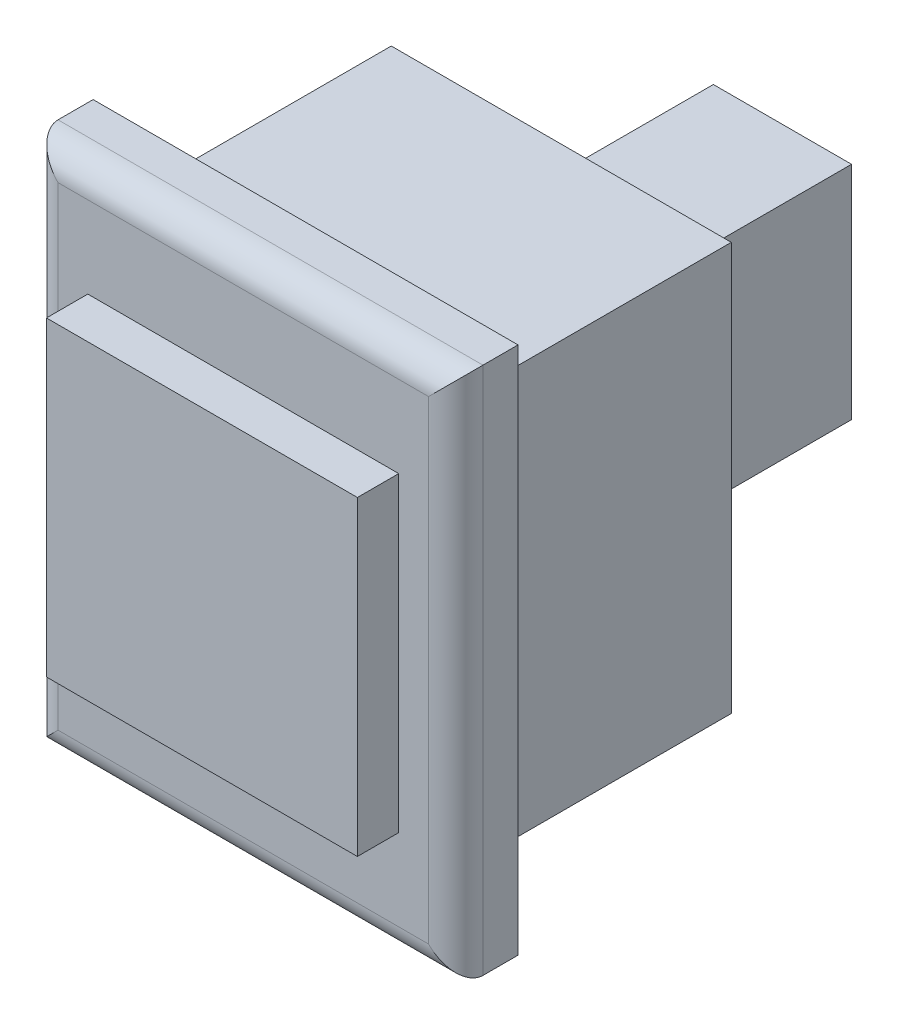
ISO-10303-21;
HEADER;
FILE_DESCRIPTION(('STEP AP214'),'2;1');
FILE_NAME('part.step','',(''),(''),'','','');
FILE_SCHEMA(('AUTOMOTIVE_DESIGN { 1 0 10303 214 1 1 1 1 }'));
ENDSEC;
DATA;
#1=APPLICATION_CONTEXT('core data for automotive mechanical design processes');
#2=APPLICATION_PROTOCOL_DEFINITION('international standard','automotive_design',2000,#1);
#3=PRODUCT_CONTEXT('',#1,'mechanical');
#4=PRODUCT('Part','Part','',(#3));
#5=PRODUCT_RELATED_PRODUCT_CATEGORY('part','',(#4));
#6=PRODUCT_DEFINITION_FORMATION('','',#4);
#7=PRODUCT_DEFINITION_CONTEXT('part definition',#1,'design');
#8=PRODUCT_DEFINITION('design','',#6,#7);
#9=PRODUCT_DEFINITION_SHAPE('','',#8);
#10=(LENGTH_UNIT() NAMED_UNIT(*) SI_UNIT(.MILLI.,.METRE.));
#11=(NAMED_UNIT(*) PLANE_ANGLE_UNIT() SI_UNIT($,.RADIAN.));
#12=(NAMED_UNIT(*) SI_UNIT($,.STERADIAN.) SOLID_ANGLE_UNIT());
#13=UNCERTAINTY_MEASURE_WITH_UNIT(LENGTH_MEASURE(1.E-05),#10,'distance_accuracy_value','');
#14=(GEOMETRIC_REPRESENTATION_CONTEXT(3) GLOBAL_UNCERTAINTY_ASSIGNED_CONTEXT((#13)) GLOBAL_UNIT_ASSIGNED_CONTEXT((#10,
#11,#12)) REPRESENTATION_CONTEXT('',''));
#15=CARTESIAN_POINT('',(0.,0.,0.));
#16=DIRECTION('',(0.,0.,1.));
#17=DIRECTION('',(1.,0.,0.));
#18=AXIS2_PLACEMENT_3D('',#15,#16,#17);
#19=CARTESIAN_POINT('',(0.,0.,-9.4));
#20=DIRECTION('',(0.,0.,-1.));
#21=DIRECTION('',(-1.,0.,0.));
#22=AXIS2_PLACEMENT_3D('',#19,#20,#21);
#23=PLANE('',#22);
#24=DIRECTION('',(0.,1.,0.));
#25=VECTOR('',#24,1.);
#26=CARTESIAN_POINT('',(-6.25,7.5,-9.4));
#27=LINE('',#26,#25);
#28=CARTESIAN_POINT('',(-6.25,-7.5,-9.4));
#29=VERTEX_POINT('',#28);
#30=CARTESIAN_POINT('',(-6.25,7.5,-9.4));
#31=VERTEX_POINT('',#30);
#32=EDGE_CURVE('E191',#29,#31,#27,.T.);
#33=ORIENTED_EDGE('',*,*,#32,.T.);
#34=DIRECTION('',(1.,0.,0.));
#35=VECTOR('',#34,1.);
#36=CARTESIAN_POINT('',(6.25,7.5,-9.4));
#37=LINE('',#36,#35);
#38=CARTESIAN_POINT('',(6.25,7.5,-9.4));
#39=VERTEX_POINT('',#38);
#40=EDGE_CURVE('E194',#31,#39,#37,.T.);
#41=ORIENTED_EDGE('',*,*,#40,.T.);
#42=DIRECTION('',(0.,-1.,0.));
#43=VECTOR('',#42,1.);
#44=CARTESIAN_POINT('',(6.25,7.5,-9.4));
#45=LINE('',#44,#43);
#46=CARTESIAN_POINT('',(6.25,-7.5,-9.4));
#47=VERTEX_POINT('',#46);
#48=EDGE_CURVE('E197',#39,#47,#45,.T.);
#49=ORIENTED_EDGE('',*,*,#48,.T.);
#50=DIRECTION('',(-1.,0.,0.));
#51=VECTOR('',#50,1.);
#52=CARTESIAN_POINT('',(6.25,-7.5,-9.4));
#53=LINE('',#52,#51);
#54=EDGE_CURVE('E199',#47,#29,#53,.T.);
#55=ORIENTED_EDGE('',*,*,#54,.T.);
#56=EDGE_LOOP('',(#33,#41,#49,#55));
#57=FACE_BOUND('',#56,.T.);
#58=DIRECTION('',(1.,0.,0.));
#59=VECTOR('',#58,1.);
#60=CARTESIAN_POINT('',(2.54,4.065,-9.4));
#61=LINE('',#60,#59);
#62=CARTESIAN_POINT('',(-2.54,4.065,-9.4));
#63=VERTEX_POINT('',#62);
#64=CARTESIAN_POINT('',(2.54,4.065,-9.4));
#65=VERTEX_POINT('',#64);
#66=EDGE_CURVE('E564',#63,#65,#61,.T.);
#67=ORIENTED_EDGE('',*,*,#66,.F.);
#68=DIRECTION('',(0.,1.,0.));
#69=VECTOR('',#68,1.);
#70=CARTESIAN_POINT('',(-2.54,4.065,-9.4));
#71=LINE('',#70,#69);
#72=CARTESIAN_POINT('',(-2.54,-4.065,-9.4));
#73=VERTEX_POINT('',#72);
#74=EDGE_CURVE('E182',#73,#63,#71,.T.);
#75=ORIENTED_EDGE('',*,*,#74,.F.);
#76=DIRECTION('',(-1.,0.,0.));
#77=VECTOR('',#76,1.);
#78=CARTESIAN_POINT('',(2.54,-4.065,-9.4));
#79=LINE('',#78,#77);
#80=CARTESIAN_POINT('',(2.54,-4.065,-9.4));
#81=VERTEX_POINT('',#80);
#82=EDGE_CURVE('E178',#81,#73,#79,.T.);
#83=ORIENTED_EDGE('',*,*,#82,.F.);
#84=DIRECTION('',(0.,-1.,0.));
#85=VECTOR('',#84,1.);
#86=CARTESIAN_POINT('',(2.54,4.065,-9.4));
#87=LINE('',#86,#85);
#88=EDGE_CURVE('E561',#65,#81,#87,.T.);
#89=ORIENTED_EDGE('',*,*,#88,.F.);
#90=EDGE_LOOP('',(#67,#75,#83,#89));
#91=FACE_BOUND('',#90,.T.);
#92=ADVANCED_FACE('F33',(#57,#91),#23,.T.);
#93=CARTESIAN_POINT('',(0.,0.,0.));
#94=DIRECTION('',(0.,0.,1.));
#95=DIRECTION('',(1.,0.,0.));
#96=AXIS2_PLACEMENT_3D('',#93,#94,#95);
#97=PLANE('',#96);
#98=DIRECTION('',(0.,1.,0.));
#99=VECTOR('',#98,1.);
#100=CARTESIAN_POINT('',(7.81,9.715,0.));
#101=LINE('',#100,#99);
#102=CARTESIAN_POINT('',(7.81,-9.715,0.));
#103=VERTEX_POINT('',#102);
#104=CARTESIAN_POINT('',(7.81,9.715,0.));
#105=VERTEX_POINT('',#104);
#106=EDGE_CURVE('E255',#103,#105,#101,.T.);
#107=ORIENTED_EDGE('',*,*,#106,.F.);
#108=DIRECTION('',(1.,0.,0.));
#109=VECTOR('',#108,1.);
#110=CARTESIAN_POINT('',(-7.81,-9.715,0.));
#111=LINE('',#110,#109);
#112=CARTESIAN_POINT('',(-7.81,-9.715,0.));
#113=VERTEX_POINT('',#112);
#114=EDGE_CURVE('E264',#113,#103,#111,.T.);
#115=ORIENTED_EDGE('',*,*,#114,.F.);
#116=DIRECTION('',(0.,-1.,0.));
#117=VECTOR('',#116,1.);
#118=CARTESIAN_POINT('',(-7.81,9.715,0.));
#119=LINE('',#118,#117);
#120=CARTESIAN_POINT('',(-7.81,9.715,0.));
#121=VERTEX_POINT('',#120);
#122=EDGE_CURVE('E261',#121,#113,#119,.T.);
#123=ORIENTED_EDGE('',*,*,#122,.F.);
#124=DIRECTION('',(-1.,0.,0.));
#125=VECTOR('',#124,1.);
#126=CARTESIAN_POINT('',(-7.81,9.715,0.));
#127=LINE('',#126,#125);
#128=EDGE_CURVE('E258',#105,#121,#127,.T.);
#129=ORIENTED_EDGE('',*,*,#128,.F.);
#130=EDGE_LOOP('',(#107,#115,#123,#129));
#131=FACE_BOUND('',#130,.T.);
#132=DIRECTION('',(0.,1.,0.));
#133=VECTOR('',#132,1.);
#134=CARTESIAN_POINT('',(-6.25,7.5,0.));
#135=LINE('',#134,#133);
#136=CARTESIAN_POINT('',(-6.25,-7.5,0.));
#137=VERTEX_POINT('',#136);
#138=CARTESIAN_POINT('',(-6.25,7.5,0.));
#139=VERTEX_POINT('',#138);
#140=EDGE_CURVE('E184',#137,#139,#135,.T.);
#141=ORIENTED_EDGE('',*,*,#140,.F.);
#142=DIRECTION('',(-1.,0.,0.));
#143=VECTOR('',#142,1.);
#144=CARTESIAN_POINT('',(6.25,-7.5,0.));
#145=LINE('',#144,#143);
#146=CARTESIAN_POINT('',(6.25,-7.5,0.));
#147=VERTEX_POINT('',#146);
#148=EDGE_CURVE('E195',#147,#137,#145,.T.);
#149=ORIENTED_EDGE('',*,*,#148,.F.);
#150=DIRECTION('',(0.,-1.,0.));
#151=VECTOR('',#150,1.);
#152=CARTESIAN_POINT('',(6.25,7.5,0.));
#153=LINE('',#152,#151);
#154=CARTESIAN_POINT('',(6.25,7.5,0.));
#155=VERTEX_POINT('',#154);
#156=EDGE_CURVE('E203',#155,#147,#153,.T.);
#157=ORIENTED_EDGE('',*,*,#156,.F.);
#158=DIRECTION('',(1.,0.,0.));
#159=VECTOR('',#158,1.);
#160=CARTESIAN_POINT('',(6.25,7.5,0.));
#161=LINE('',#160,#159);
#162=EDGE_CURVE('E58',#139,#155,#161,.T.);
#163=ORIENTED_EDGE('',*,*,#162,.F.);
#164=EDGE_LOOP('',(#141,#149,#157,#163));
#165=FACE_BOUND('',#164,.T.);
#166=ADVANCED_FACE('F320',(#131,#165),#97,.F.);
#167=CARTESIAN_POINT('',(7.81,9.715,2.29));
#168=DIRECTION('',(-1.,0.,0.));
#169=DIRECTION('',(0.,-1.,0.));
#170=AXIS2_PLACEMENT_3D('',#167,#168,#169);
#171=PLANE('',#170);
#172=DIRECTION('',(0.,0.,-1.));
#173=VECTOR('',#172,1.);
#174=CARTESIAN_POINT('',(7.81,9.715,2.29));
#175=LINE('',#174,#173);
#176=CARTESIAN_POINT('',(7.81,9.715,1.29));
#177=VERTEX_POINT('',#176);
#178=EDGE_CURVE('E273',#177,#105,#175,.T.);
#179=ORIENTED_EDGE('',*,*,#178,.F.);
#180=DIRECTION('',(0.,1.,0.));
#181=VECTOR('',#180,1.);
#182=CARTESIAN_POINT('',(7.81,-9.715,1.29));
#183=LINE('',#182,#181);
#184=CARTESIAN_POINT('',(7.81,-9.715,1.29));
#185=VERTEX_POINT('',#184);
#186=EDGE_CURVE('E42',#177,#185,#183,.F.);
#187=ORIENTED_EDGE('',*,*,#186,.T.);
#188=DIRECTION('',(0.,0.,-1.));
#189=VECTOR('',#188,1.);
#190=CARTESIAN_POINT('',(7.81,-9.715,2.29));
#191=LINE('',#190,#189);
#192=EDGE_CURVE('E267',#185,#103,#191,.T.);
#193=ORIENTED_EDGE('',*,*,#192,.T.);
#194=ORIENTED_EDGE('',*,*,#106,.T.);
#195=EDGE_LOOP('',(#179,#187,#193,#194));
#196=FACE_BOUND('',#195,.T.);
#197=ADVANCED_FACE('F311',(#196),#171,.F.);
#198=CARTESIAN_POINT('',(-7.81,9.715,2.29));
#199=DIRECTION('',(0.,-1.,0.));
#200=DIRECTION('',(0.,0.,-1.));
#201=AXIS2_PLACEMENT_3D('',#198,#199,#200);
#202=PLANE('',#201);
#203=DIRECTION('',(0.,0.,-1.));
#204=VECTOR('',#203,1.);
#205=CARTESIAN_POINT('',(-7.81,9.715,2.29));
#206=LINE('',#205,#204);
#207=CARTESIAN_POINT('',(-7.81,9.715,1.29));
#208=VERTEX_POINT('',#207);
#209=EDGE_CURVE('E271',#208,#121,#206,.T.);
#210=ORIENTED_EDGE('',*,*,#209,.F.);
#211=DIRECTION('',(-1.,0.,0.));
#212=VECTOR('',#211,1.);
#213=CARTESIAN_POINT('',(7.81,9.715,1.29));
#214=LINE('',#213,#212);
#215=EDGE_CURVE('E11',#208,#177,#214,.F.);
#216=ORIENTED_EDGE('',*,*,#215,.T.);
#217=ORIENTED_EDGE('',*,*,#178,.T.);
#218=ORIENTED_EDGE('',*,*,#128,.T.);
#219=EDGE_LOOP('',(#210,#216,#217,#218));
#220=FACE_BOUND('',#219,.T.);
#221=ADVANCED_FACE('F323',(#220),#202,.F.);
#222=CARTESIAN_POINT('',(-7.81,9.715,2.29));
#223=DIRECTION('',(1.,0.,0.));
#224=DIRECTION('',(0.,1.,0.));
#225=AXIS2_PLACEMENT_3D('',#222,#223,#224);
#226=PLANE('',#225);
#227=DIRECTION('',(0.,0.,-1.));
#228=VECTOR('',#227,1.);
#229=CARTESIAN_POINT('',(-7.81,-9.715,2.29));
#230=LINE('',#229,#228);
#231=CARTESIAN_POINT('',(-7.81,-9.715,1.29));
#232=VERTEX_POINT('',#231);
#233=EDGE_CURVE('E269',#232,#113,#230,.T.);
#234=ORIENTED_EDGE('',*,*,#233,.F.);
#235=DIRECTION('',(0.,-1.,0.));
#236=VECTOR('',#235,1.);
#237=CARTESIAN_POINT('',(-7.81,9.715,1.29));
#238=LINE('',#237,#236);
#239=EDGE_CURVE('E284',#232,#208,#238,.F.);
#240=ORIENTED_EDGE('',*,*,#239,.T.);
#241=ORIENTED_EDGE('',*,*,#209,.T.);
#242=ORIENTED_EDGE('',*,*,#122,.T.);
#243=EDGE_LOOP('',(#234,#240,#241,#242));
#244=FACE_BOUND('',#243,.T.);
#245=ADVANCED_FACE('F325',(#244),#226,.F.);
#246=CARTESIAN_POINT('',(-7.81,-9.715,2.29));
#247=DIRECTION('',(0.,1.,0.));
#248=DIRECTION('',(0.,0.,1.));
#249=AXIS2_PLACEMENT_3D('',#246,#247,#248);
#250=PLANE('',#249);
#251=ORIENTED_EDGE('',*,*,#192,.F.);
#252=DIRECTION('',(1.,0.,0.));
#253=VECTOR('',#252,1.);
#254=CARTESIAN_POINT('',(-7.81,-9.715,1.29));
#255=LINE('',#254,#253);
#256=EDGE_CURVE('E287',#185,#232,#255,.F.);
#257=ORIENTED_EDGE('',*,*,#256,.T.);
#258=ORIENTED_EDGE('',*,*,#233,.T.);
#259=ORIENTED_EDGE('',*,*,#114,.T.);
#260=EDGE_LOOP('',(#251,#257,#258,#259));
#261=FACE_BOUND('',#260,.T.);
#262=ADVANCED_FACE('F313',(#261),#250,.F.);
#263=CARTESIAN_POINT('',(0.,0.,2.29));
#264=DIRECTION('',(0.,0.,1.));
#265=DIRECTION('',(1.,0.,0.));
#266=AXIS2_PLACEMENT_3D('',#263,#264,#265);
#267=PLANE('',#266);
#268=DIRECTION('',(-1.,0.,0.));
#269=VECTOR('',#268,1.);
#270=CARTESIAN_POINT('',(-7.81,8.715,2.29));
#271=LINE('',#270,#269);
#272=CARTESIAN_POINT('',(6.81,8.715,2.29));
#273=VERTEX_POINT('',#272);
#274=CARTESIAN_POINT('',(-6.81,8.715,2.29));
#275=VERTEX_POINT('',#274);
#276=EDGE_CURVE('E275',#273,#275,#271,.T.);
#277=ORIENTED_EDGE('',*,*,#276,.T.);
#278=DIRECTION('',(0.,-1.,0.));
#279=VECTOR('',#278,1.);
#280=CARTESIAN_POINT('',(-6.81,-9.715,2.29));
#281=LINE('',#280,#279);
#282=CARTESIAN_POINT('',(-6.81,-8.715,2.29));
#283=VERTEX_POINT('',#282);
#284=EDGE_CURVE('E281',#275,#283,#281,.T.);
#285=ORIENTED_EDGE('',*,*,#284,.T.);
#286=DIRECTION('',(1.,0.,0.));
#287=VECTOR('',#286,1.);
#288=CARTESIAN_POINT('',(7.81,-8.715,2.29));
#289=LINE('',#288,#287);
#290=CARTESIAN_POINT('',(6.81,-8.715,2.29));
#291=VERTEX_POINT('',#290);
#292=EDGE_CURVE('E279',#283,#291,#289,.T.);
#293=ORIENTED_EDGE('',*,*,#292,.T.);
#294=DIRECTION('',(0.,1.,0.));
#295=VECTOR('',#294,1.);
#296=CARTESIAN_POINT('',(6.81,9.715,2.29));
#297=LINE('',#296,#295);
#298=EDGE_CURVE('E277',#291,#273,#297,.T.);
#299=ORIENTED_EDGE('',*,*,#298,.T.);
#300=EDGE_LOOP('',(#277,#285,#293,#299));
#301=FACE_BOUND('',#300,.T.);
#302=DIRECTION('',(0.,1.,0.));
#303=VECTOR('',#302,1.);
#304=CARTESIAN_POINT('',(5.715,0.,2.29));
#305=LINE('',#304,#303);
#306=CARTESIAN_POINT('',(5.715,-5.715,2.29));
#307=VERTEX_POINT('',#306);
#308=CARTESIAN_POINT('',(5.715,5.715,2.29));
#309=VERTEX_POINT('',#308);
#310=EDGE_CURVE('E252',#307,#309,#305,.T.);
#311=ORIENTED_EDGE('',*,*,#310,.F.);
#312=DIRECTION('',(1.,0.,0.));
#313=VECTOR('',#312,1.);
#314=CARTESIAN_POINT('',(0.,-5.715,2.29));
#315=LINE('',#314,#313);
#316=CARTESIAN_POINT('',(-5.71500000000001,-5.715,2.29));
#317=VERTEX_POINT('',#316);
#318=EDGE_CURVE('E235',#317,#307,#315,.T.);
#319=ORIENTED_EDGE('',*,*,#318,.F.);
#320=DIRECTION('',(0.,-1.,0.));
#321=VECTOR('',#320,1.);
#322=CARTESIAN_POINT('',(-5.715,0.,2.29));
#323=LINE('',#322,#321);
#324=CARTESIAN_POINT('',(-5.715,5.715,2.29));
#325=VERTEX_POINT('',#324);
#326=EDGE_CURVE('E246',#325,#317,#323,.T.);
#327=ORIENTED_EDGE('',*,*,#326,.F.);
#328=DIRECTION('',(-1.,0.,0.));
#329=VECTOR('',#328,1.);
#330=CARTESIAN_POINT('',(0.,5.715,2.29));
#331=LINE('',#330,#329);
#332=EDGE_CURVE('E249',#309,#325,#331,.T.);
#333=ORIENTED_EDGE('',*,*,#332,.F.);
#334=EDGE_LOOP('',(#311,#319,#327,#333));
#335=FACE_BOUND('',#334,.T.);
#336=ADVANCED_FACE('F333',(#301,#335),#267,.T.);
#337=CARTESIAN_POINT('',(5.715,5.715,3.81));
#338=DIRECTION('',(1.,0.,0.));
#339=DIRECTION('',(0.,1.,0.));
#340=AXIS2_PLACEMENT_3D('',#337,#338,#339);
#341=PLANE('',#340);
#342=DIRECTION('',(0.,0.,-1.));
#343=VECTOR('',#342,1.);
#344=CARTESIAN_POINT('',(5.715,-5.715,3.81));
#345=LINE('',#344,#343);
#346=CARTESIAN_POINT('',(5.715,-5.715,3.81));
#347=VERTEX_POINT('',#346);
#348=EDGE_CURVE('E231',#347,#307,#345,.T.);
#349=ORIENTED_EDGE('',*,*,#348,.T.);
#350=ORIENTED_EDGE('',*,*,#310,.T.);
#351=DIRECTION('',(0.,0.,-1.));
#352=VECTOR('',#351,1.);
#353=CARTESIAN_POINT('',(5.715,5.715,3.81));
#354=LINE('',#353,#352);
#355=CARTESIAN_POINT('',(5.715,5.715,3.81));
#356=VERTEX_POINT('',#355);
#357=EDGE_CURVE('E232',#356,#309,#354,.T.);
#358=ORIENTED_EDGE('',*,*,#357,.F.);
#359=DIRECTION('',(0.,-1.,0.));
#360=VECTOR('',#359,1.);
#361=CARTESIAN_POINT('',(5.715,5.715,3.81));
#362=LINE('',#361,#360);
#363=EDGE_CURVE('E219',#356,#347,#362,.T.);
#364=ORIENTED_EDGE('',*,*,#363,.T.);
#365=EDGE_LOOP('',(#349,#350,#358,#364));
#366=FACE_BOUND('',#365,.T.);
#367=ADVANCED_FACE('F336',(#366),#341,.T.);
#368=CARTESIAN_POINT('',(-5.715,5.715,3.81));
#369=DIRECTION('',(0.,1.,0.));
#370=DIRECTION('',(-1.,0.,0.));
#371=AXIS2_PLACEMENT_3D('',#368,#369,#370);
#372=PLANE('',#371);
#373=ORIENTED_EDGE('',*,*,#357,.T.);
#374=ORIENTED_EDGE('',*,*,#332,.T.);
#375=DIRECTION('',(0.,0.,-1.));
#376=VECTOR('',#375,1.);
#377=CARTESIAN_POINT('',(-5.715,5.715,3.81));
#378=LINE('',#377,#376);
#379=CARTESIAN_POINT('',(-5.715,5.715,3.81));
#380=VERTEX_POINT('',#379);
#381=EDGE_CURVE('E236',#380,#325,#378,.T.);
#382=ORIENTED_EDGE('',*,*,#381,.F.);
#383=DIRECTION('',(1.,0.,0.));
#384=VECTOR('',#383,1.);
#385=CARTESIAN_POINT('',(-5.715,5.715,3.81));
#386=LINE('',#385,#384);
#387=EDGE_CURVE('E228',#380,#356,#386,.T.);
#388=ORIENTED_EDGE('',*,*,#387,.T.);
#389=EDGE_LOOP('',(#373,#374,#382,#388));
#390=FACE_BOUND('',#389,.T.);
#391=ADVANCED_FACE('F348',(#390),#372,.T.);
#392=CARTESIAN_POINT('',(-5.715,5.715,3.81));
#393=DIRECTION('',(-1.,0.,0.));
#394=DIRECTION('',(0.,-1.,0.));
#395=AXIS2_PLACEMENT_3D('',#392,#393,#394);
#396=PLANE('',#395);
#397=ORIENTED_EDGE('',*,*,#381,.T.);
#398=ORIENTED_EDGE('',*,*,#326,.T.);
#399=DIRECTION('',(0.,0.,-1.));
#400=VECTOR('',#399,1.);
#401=CARTESIAN_POINT('',(-5.71500000000001,-5.715,3.81));
#402=LINE('',#401,#400);
#403=CARTESIAN_POINT('',(-5.71500000000001,-5.715,3.81));
#404=VERTEX_POINT('',#403);
#405=EDGE_CURVE('E239',#404,#317,#402,.T.);
#406=ORIENTED_EDGE('',*,*,#405,.F.);
#407=DIRECTION('',(0.,1.,0.));
#408=VECTOR('',#407,1.);
#409=CARTESIAN_POINT('',(-5.715,5.715,3.81));
#410=LINE('',#409,#408);
#411=EDGE_CURVE('E225',#404,#380,#410,.T.);
#412=ORIENTED_EDGE('',*,*,#411,.T.);
#413=EDGE_LOOP('',(#397,#398,#406,#412));
#414=FACE_BOUND('',#413,.T.);
#415=ADVANCED_FACE('F350',(#414),#396,.T.);
#416=CARTESIAN_POINT('',(-5.71500000000001,-5.715,3.81));
#417=DIRECTION('',(0.,-1.,0.));
#418=DIRECTION('',(1.,0.,0.));
#419=AXIS2_PLACEMENT_3D('',#416,#417,#418);
#420=PLANE('',#419);
#421=ORIENTED_EDGE('',*,*,#405,.T.);
#422=ORIENTED_EDGE('',*,*,#318,.T.);
#423=ORIENTED_EDGE('',*,*,#348,.F.);
#424=DIRECTION('',(-1.,0.,0.));
#425=VECTOR('',#424,1.);
#426=CARTESIAN_POINT('',(-5.71500000000001,-5.715,3.81));
#427=LINE('',#426,#425);
#428=EDGE_CURVE('E222',#347,#404,#427,.T.);
#429=ORIENTED_EDGE('',*,*,#428,.T.);
#430=EDGE_LOOP('',(#421,#422,#423,#429));
#431=FACE_BOUND('',#430,.T.);
#432=ADVANCED_FACE('F340',(#431),#420,.T.);
#433=CARTESIAN_POINT('',(0.,0.,3.81));
#434=DIRECTION('',(0.,0.,1.));
#435=DIRECTION('',(1.,0.,0.));
#436=AXIS2_PLACEMENT_3D('',#433,#434,#435);
#437=PLANE('',#436);
#438=ORIENTED_EDGE('',*,*,#363,.F.);
#439=ORIENTED_EDGE('',*,*,#387,.F.);
#440=ORIENTED_EDGE('',*,*,#411,.F.);
#441=ORIENTED_EDGE('',*,*,#428,.F.);
#442=EDGE_LOOP('',(#438,#439,#440,#441));
#443=FACE_BOUND('',#442,.T.);
#444=ADVANCED_FACE('F345',(#443),#437,.T.);
#445=CARTESIAN_POINT('',(6.81,0.,1.29));
#446=DIRECTION('',(0.,-1.,0.));
#447=DIRECTION('',(1.,0.,0.));
#448=AXIS2_PLACEMENT_3D('',#445,#446,#447);
#449=CYLINDRICAL_SURFACE('',#448,1.);
#450=CARTESIAN_POINT('',(6.81,-8.715,1.29));
#451=DIRECTION('',(-0.707106781186547,-0.707106781186548,0.));
#452=DIRECTION('',(0.707106781186548,-0.707106781186547,0.));
#453=AXIS2_PLACEMENT_3D('',#450,#451,#452);
#454=ELLIPSE('',#453,1.4142135623731,1.);
#455=EDGE_CURVE('E292',#185,#291,#454,.T.);
#456=ORIENTED_EDGE('',*,*,#455,.F.);
#457=ORIENTED_EDGE('',*,*,#186,.F.);
#458=CARTESIAN_POINT('',(6.81,8.715,1.29));
#459=DIRECTION('',(0.707106781186548,-0.707106781186547,0.));
#460=DIRECTION('',(0.707106781186547,0.707106781186548,0.));
#461=AXIS2_PLACEMENT_3D('',#458,#459,#460);
#462=ELLIPSE('',#461,1.41421356237309,1.);
#463=EDGE_CURVE('E37',#273,#177,#462,.F.);
#464=ORIENTED_EDGE('',*,*,#463,.F.);
#465=ORIENTED_EDGE('',*,*,#298,.F.);
#466=EDGE_LOOP('',(#456,#457,#464,#465));
#467=FACE_BOUND('',#466,.T.);
#468=ADVANCED_FACE('F35',(#467),#449,.T.);
#469=CARTESIAN_POINT('',(0.,8.715,1.29));
#470=DIRECTION('',(1.,0.,0.));
#471=DIRECTION('',(0.,0.,-1.));
#472=AXIS2_PLACEMENT_3D('',#469,#470,#471);
#473=CYLINDRICAL_SURFACE('',#472,1.);
#474=ORIENTED_EDGE('',*,*,#463,.T.);
#475=ORIENTED_EDGE('',*,*,#215,.F.);
#476=CARTESIAN_POINT('',(-6.81,8.715,1.29));
#477=DIRECTION('',(0.707106781186547,0.707106781186548,0.));
#478=DIRECTION('',(0.707106781186548,-0.707106781186547,0.));
#479=AXIS2_PLACEMENT_3D('',#476,#477,#478);
#480=ELLIPSE('',#479,1.4142135623731,1.);
#481=EDGE_CURVE('E291',#275,#208,#480,.F.);
#482=ORIENTED_EDGE('',*,*,#481,.F.);
#483=ORIENTED_EDGE('',*,*,#276,.F.);
#484=EDGE_LOOP('',(#474,#475,#482,#483));
#485=FACE_BOUND('',#484,.T.);
#486=ADVANCED_FACE('F303',(#485),#473,.T.);
#487=CARTESIAN_POINT('',(0.,-8.715,1.29));
#488=DIRECTION('',(-1.,0.,0.));
#489=DIRECTION('',(0.,0.,1.));
#490=AXIS2_PLACEMENT_3D('',#487,#488,#489);
#491=CYLINDRICAL_SURFACE('',#490,1.);
#492=ORIENTED_EDGE('',*,*,#455,.T.);
#493=ORIENTED_EDGE('',*,*,#292,.F.);
#494=CARTESIAN_POINT('',(-6.81,-8.715,1.29));
#495=DIRECTION('',(-0.707106781186548,0.707106781186547,0.));
#496=DIRECTION('',(-0.707106781186547,-0.707106781186548,0.));
#497=AXIS2_PLACEMENT_3D('',#494,#495,#496);
#498=ELLIPSE('',#497,1.41421356237309,1.);
#499=EDGE_CURVE('E218',#232,#283,#498,.T.);
#500=ORIENTED_EDGE('',*,*,#499,.F.);
#501=ORIENTED_EDGE('',*,*,#256,.F.);
#502=EDGE_LOOP('',(#492,#493,#500,#501));
#503=FACE_BOUND('',#502,.T.);
#504=ADVANCED_FACE('F331',(#503),#491,.T.);
#505=CARTESIAN_POINT('',(-6.81,0.,1.29));
#506=DIRECTION('',(0.,1.,0.));
#507=DIRECTION('',(-1.,0.,0.));
#508=AXIS2_PLACEMENT_3D('',#505,#506,#507);
#509=CYLINDRICAL_SURFACE('',#508,1.);
#510=ORIENTED_EDGE('',*,*,#481,.T.);
#511=ORIENTED_EDGE('',*,*,#239,.F.);
#512=ORIENTED_EDGE('',*,*,#499,.T.);
#513=ORIENTED_EDGE('',*,*,#284,.F.);
#514=EDGE_LOOP('',(#510,#511,#512,#513));
#515=FACE_BOUND('',#514,.T.);
#516=ADVANCED_FACE('F329',(#515),#509,.T.);
#517=CARTESIAN_POINT('',(-6.25,7.5,-9.4));
#518=DIRECTION('',(1.,0.,0.));
#519=DIRECTION('',(0.,1.,0.));
#520=AXIS2_PLACEMENT_3D('',#517,#518,#519);
#521=PLANE('',#520);
#522=ORIENTED_EDGE('',*,*,#140,.T.);
#523=DIRECTION('',(0.,0.,1.));
#524=VECTOR('',#523,1.);
#525=CARTESIAN_POINT('',(-6.25,7.5,-9.4));
#526=LINE('',#525,#524);
#527=EDGE_CURVE('E216',#31,#139,#526,.T.);
#528=ORIENTED_EDGE('',*,*,#527,.F.);
#529=ORIENTED_EDGE('',*,*,#32,.F.);
#530=DIRECTION('',(0.,0.,1.));
#531=VECTOR('',#530,1.);
#532=CARTESIAN_POINT('',(-6.25,-7.5,-9.4));
#533=LINE('',#532,#531);
#534=EDGE_CURVE('E200',#29,#137,#533,.T.);
#535=ORIENTED_EDGE('',*,*,#534,.T.);
#536=EDGE_LOOP('',(#522,#528,#529,#535));
#537=FACE_BOUND('',#536,.T.);
#538=ADVANCED_FACE('F381',(#537),#521,.F.);
#539=CARTESIAN_POINT('',(6.25,7.5,-9.4));
#540=DIRECTION('',(0.,-1.,0.));
#541=DIRECTION('',(0.,0.,-1.));
#542=AXIS2_PLACEMENT_3D('',#539,#540,#541);
#543=PLANE('',#542);
#544=ORIENTED_EDGE('',*,*,#162,.T.);
#545=DIRECTION('',(0.,0.,1.));
#546=VECTOR('',#545,1.);
#547=CARTESIAN_POINT('',(6.25,7.5,-9.4));
#548=LINE('',#547,#546);
#549=EDGE_CURVE('E213',#39,#155,#548,.T.);
#550=ORIENTED_EDGE('',*,*,#549,.F.);
#551=ORIENTED_EDGE('',*,*,#40,.F.);
#552=ORIENTED_EDGE('',*,*,#527,.T.);
#553=EDGE_LOOP('',(#544,#550,#551,#552));
#554=FACE_BOUND('',#553,.T.);
#555=ADVANCED_FACE('F377',(#554),#543,.F.);
#556=CARTESIAN_POINT('',(6.25,7.5,-9.4));
#557=DIRECTION('',(-1.,0.,0.));
#558=DIRECTION('',(0.,-1.,0.));
#559=AXIS2_PLACEMENT_3D('',#556,#557,#558);
#560=PLANE('',#559);
#561=ORIENTED_EDGE('',*,*,#156,.T.);
#562=DIRECTION('',(0.,0.,1.));
#563=VECTOR('',#562,1.);
#564=CARTESIAN_POINT('',(6.25,-7.5,-9.4));
#565=LINE('',#564,#563);
#566=EDGE_CURVE('E210',#47,#147,#565,.T.);
#567=ORIENTED_EDGE('',*,*,#566,.F.);
#568=ORIENTED_EDGE('',*,*,#48,.F.);
#569=ORIENTED_EDGE('',*,*,#549,.T.);
#570=EDGE_LOOP('',(#561,#567,#568,#569));
#571=FACE_BOUND('',#570,.T.);
#572=ADVANCED_FACE('F373',(#571),#560,.F.);
#573=CARTESIAN_POINT('',(6.25,-7.5,-9.4));
#574=DIRECTION('',(0.,1.,0.));
#575=DIRECTION('',(0.,0.,1.));
#576=AXIS2_PLACEMENT_3D('',#573,#574,#575);
#577=PLANE('',#576);
#578=ORIENTED_EDGE('',*,*,#148,.T.);
#579=ORIENTED_EDGE('',*,*,#534,.F.);
#580=ORIENTED_EDGE('',*,*,#54,.F.);
#581=ORIENTED_EDGE('',*,*,#566,.T.);
#582=EDGE_LOOP('',(#578,#579,#580,#581));
#583=FACE_BOUND('',#582,.T.);
#584=ADVANCED_FACE('F370',(#583),#577,.F.);
#585=CARTESIAN_POINT('',(-2.54,4.065,-17.53));
#586=DIRECTION('',(1.,0.,0.));
#587=DIRECTION('',(0.,1.,0.));
#588=AXIS2_PLACEMENT_3D('',#585,#586,#587);
#589=PLANE('',#588);
#590=ORIENTED_EDGE('',*,*,#74,.T.);
#591=DIRECTION('',(0.,0.,1.));
#592=VECTOR('',#591,1.);
#593=CARTESIAN_POINT('',(-2.54,4.065,-17.53));
#594=LINE('',#593,#592);
#595=CARTESIAN_POINT('',(-2.54,4.065,-17.53));
#596=VERTEX_POINT('',#595);
#597=EDGE_CURVE('E163',#596,#63,#594,.T.);
#598=ORIENTED_EDGE('',*,*,#597,.F.);
#599=DIRECTION('',(0.,1.,0.));
#600=VECTOR('',#599,1.);
#601=CARTESIAN_POINT('',(-2.54,4.065,-17.53));
#602=LINE('',#601,#600);
#603=CARTESIAN_POINT('',(-2.54,-4.065,-17.53));
#604=VERTEX_POINT('',#603);
#605=EDGE_CURVE('E170',#604,#596,#602,.T.);
#606=ORIENTED_EDGE('',*,*,#605,.F.);
#607=DIRECTION('',(0.,0.,1.));
#608=VECTOR('',#607,1.);
#609=CARTESIAN_POINT('',(-2.54,-4.065,-17.53));
#610=LINE('',#609,#608);
#611=EDGE_CURVE('E559',#604,#73,#610,.T.);
#612=ORIENTED_EDGE('',*,*,#611,.T.);
#613=EDGE_LOOP('',(#590,#598,#606,#612));
#614=FACE_BOUND('',#613,.T.);
#615=ADVANCED_FACE('F180',(#614),#589,.F.);
#616=CARTESIAN_POINT('',(2.54,4.065,-17.53));
#617=DIRECTION('',(0.,-1.,0.));
#618=DIRECTION('',(0.,0.,-1.));
#619=AXIS2_PLACEMENT_3D('',#616,#617,#618);
#620=PLANE('',#619);
#621=ORIENTED_EDGE('',*,*,#66,.T.);
#622=DIRECTION('',(0.,0.,1.));
#623=VECTOR('',#622,1.);
#624=CARTESIAN_POINT('',(2.54,4.065,-17.53));
#625=LINE('',#624,#623);
#626=CARTESIAN_POINT('',(2.54,4.065,-17.53));
#627=VERTEX_POINT('',#626);
#628=EDGE_CURVE('E166',#627,#65,#625,.T.);
#629=ORIENTED_EDGE('',*,*,#628,.F.);
#630=DIRECTION('',(1.,0.,0.));
#631=VECTOR('',#630,1.);
#632=CARTESIAN_POINT('',(2.54,4.065,-17.53));
#633=LINE('',#632,#631);
#634=EDGE_CURVE('E159',#596,#627,#633,.T.);
#635=ORIENTED_EDGE('',*,*,#634,.F.);
#636=ORIENTED_EDGE('',*,*,#597,.T.);
#637=EDGE_LOOP('',(#621,#629,#635,#636));
#638=FACE_BOUND('',#637,.T.);
#639=ADVANCED_FACE('F161',(#638),#620,.F.);
#640=CARTESIAN_POINT('',(2.54,4.065,-17.53));
#641=DIRECTION('',(-1.,0.,0.));
#642=DIRECTION('',(0.,-1.,0.));
#643=AXIS2_PLACEMENT_3D('',#640,#641,#642);
#644=PLANE('',#643);
#645=ORIENTED_EDGE('',*,*,#88,.T.);
#646=DIRECTION('',(0.,0.,1.));
#647=VECTOR('',#646,1.);
#648=CARTESIAN_POINT('',(2.54,-4.065,-17.53));
#649=LINE('',#648,#647);
#650=CARTESIAN_POINT('',(2.54,-4.065,-17.53));
#651=VERTEX_POINT('',#650);
#652=EDGE_CURVE('E50',#651,#81,#649,.T.);
#653=ORIENTED_EDGE('',*,*,#652,.F.);
#654=DIRECTION('',(0.,-1.,0.));
#655=VECTOR('',#654,1.);
#656=CARTESIAN_POINT('',(2.54,4.065,-17.53));
#657=LINE('',#656,#655);
#658=EDGE_CURVE('E169',#627,#651,#657,.T.);
#659=ORIENTED_EDGE('',*,*,#658,.F.);
#660=ORIENTED_EDGE('',*,*,#628,.T.);
#661=EDGE_LOOP('',(#645,#653,#659,#660));
#662=FACE_BOUND('',#661,.T.);
#663=ADVANCED_FACE('F529',(#662),#644,.F.);
#664=CARTESIAN_POINT('',(2.54,-4.065,-17.53));
#665=DIRECTION('',(0.,1.,0.));
#666=DIRECTION('',(0.,0.,1.));
#667=AXIS2_PLACEMENT_3D('',#664,#665,#666);
#668=PLANE('',#667);
#669=ORIENTED_EDGE('',*,*,#82,.T.);
#670=ORIENTED_EDGE('',*,*,#611,.F.);
#671=DIRECTION('',(-1.,0.,0.));
#672=VECTOR('',#671,1.);
#673=CARTESIAN_POINT('',(2.54,-4.065,-17.53));
#674=LINE('',#673,#672);
#675=EDGE_CURVE('E174',#651,#604,#674,.T.);
#676=ORIENTED_EDGE('',*,*,#675,.F.);
#677=ORIENTED_EDGE('',*,*,#652,.T.);
#678=EDGE_LOOP('',(#669,#670,#676,#677));
#679=FACE_BOUND('',#678,.T.);
#680=ADVANCED_FACE('F537',(#679),#668,.F.);
#681=CARTESIAN_POINT('',(0.,0.,-17.53));
#682=DIRECTION('',(0.,0.,-1.));
#683=DIRECTION('',(-1.,0.,0.));
#684=AXIS2_PLACEMENT_3D('',#681,#682,#683);
#685=PLANE('',#684);
#686=ORIENTED_EDGE('',*,*,#605,.T.);
#687=ORIENTED_EDGE('',*,*,#634,.T.);
#688=ORIENTED_EDGE('',*,*,#658,.T.);
#689=ORIENTED_EDGE('',*,*,#675,.T.);
#690=EDGE_LOOP('',(#686,#687,#688,#689));
#691=FACE_BOUND('',#690,.T.);
#692=ADVANCED_FACE('F173',(#691),#685,.T.);
#693=CLOSED_SHELL('',(#92,#166,#197,#221,#245,#262,#336,#367,#391,#415,#432,#444,#468,#486,#504,
#516,#538,#555,#572,#584,#615,#639,#663,#680,#692));
#694=MANIFOLD_SOLID_BREP('B2',#693);
#695=ADVANCED_BREP_SHAPE_REPRESENTATION('',(#18,#694),#14);
#696=SHAPE_DEFINITION_REPRESENTATION(#9,#695);
ENDSEC;
END-ISO-10303-21;
